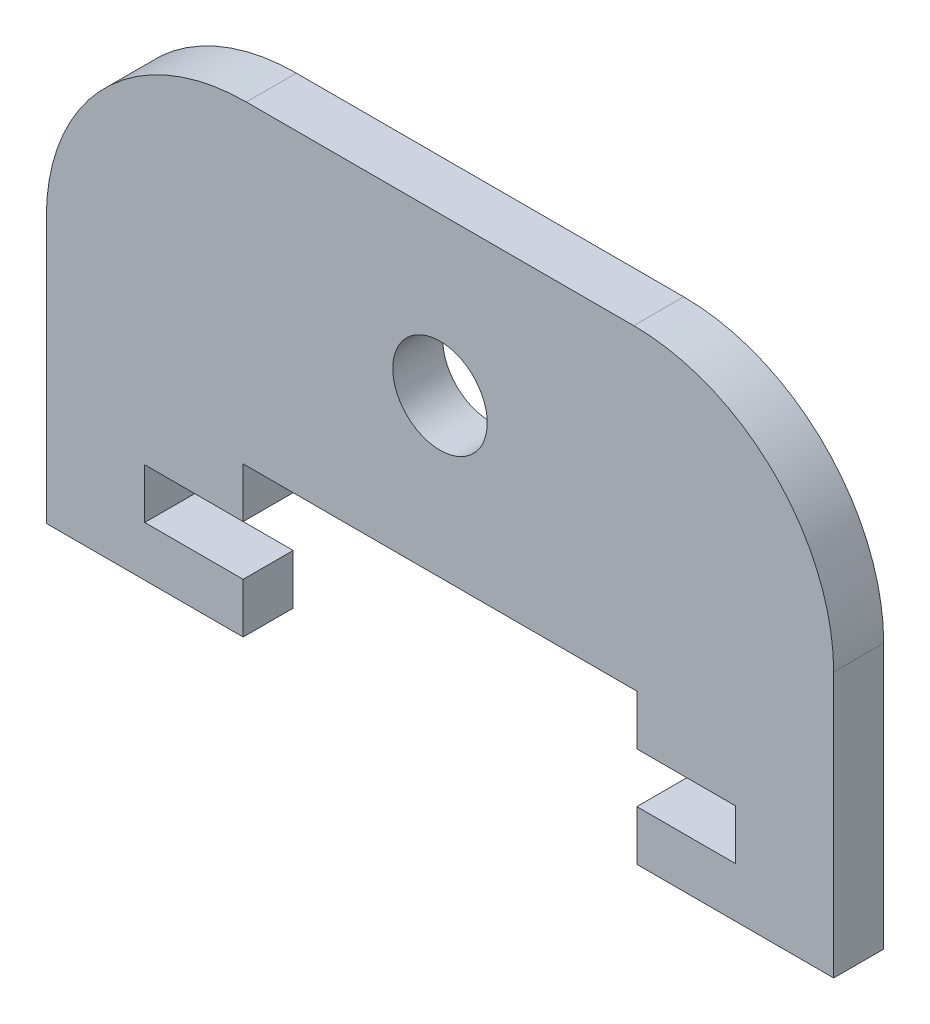
ISO-10303-21;
HEADER;
FILE_DESCRIPTION(('STEP AP214'),'2;1');
FILE_NAME('part.step','',(''),(''),'','','');
FILE_SCHEMA(('AUTOMOTIVE_DESIGN { 1 0 10303 214 1 1 1 1 }'));
ENDSEC;
DATA;
#1=APPLICATION_CONTEXT('core data for automotive mechanical design processes');
#2=APPLICATION_PROTOCOL_DEFINITION('international standard','automotive_design',2000,#1);
#3=PRODUCT_CONTEXT('',#1,'mechanical');
#4=PRODUCT('Part','Part','',(#3));
#5=PRODUCT_RELATED_PRODUCT_CATEGORY('part','',(#4));
#6=PRODUCT_DEFINITION_FORMATION('','',#4);
#7=PRODUCT_DEFINITION_CONTEXT('part definition',#1,'design');
#8=PRODUCT_DEFINITION('design','',#6,#7);
#9=PRODUCT_DEFINITION_SHAPE('','',#8);
#10=(LENGTH_UNIT() NAMED_UNIT(*) SI_UNIT(.MILLI.,.METRE.));
#11=(NAMED_UNIT(*) PLANE_ANGLE_UNIT() SI_UNIT($,.RADIAN.));
#12=(NAMED_UNIT(*) SI_UNIT($,.STERADIAN.) SOLID_ANGLE_UNIT());
#13=UNCERTAINTY_MEASURE_WITH_UNIT(LENGTH_MEASURE(1.E-05),#10,'distance_accuracy_value','');
#14=(GEOMETRIC_REPRESENTATION_CONTEXT(3) GLOBAL_UNCERTAINTY_ASSIGNED_CONTEXT((#13)) GLOBAL_UNIT_ASSIGNED_CONTEXT((#10,
#11,#12)) REPRESENTATION_CONTEXT('',''));
#15=CARTESIAN_POINT('',(0.,0.,0.));
#16=DIRECTION('',(0.,0.,1.));
#17=DIRECTION('',(1.,0.,0.));
#18=AXIS2_PLACEMENT_3D('',#15,#16,#17);
#19=CARTESIAN_POINT('',(24.9999999745,0.,6.35));
#20=DIRECTION('',(-1.,0.,0.));
#21=DIRECTION('',(0.,-1.,0.));
#22=AXIS2_PLACEMENT_3D('',#19,#20,#21);
#23=PLANE('',#22);
#24=DIRECTION('',(0.,1.,0.));
#25=VECTOR('',#24,1.);
#26=CARTESIAN_POINT('',(24.9999999745,0.,0.));
#27=LINE('',#26,#25);
#28=CARTESIAN_POINT('',(24.9999999745,-19.05,0.));
#29=VERTEX_POINT('',#28);
#30=CARTESIAN_POINT('',(24.9999999745,-12.7,0.));
#31=VERTEX_POINT('',#30);
#32=EDGE_CURVE('E188',#29,#31,#27,.T.);
#33=ORIENTED_EDGE('',*,*,#32,.T.);
#34=DIRECTION('',(0.,0.,1.));
#35=VECTOR('',#34,1.);
#36=CARTESIAN_POINT('',(24.9999999745,-12.7,0.));
#37=LINE('',#36,#35);
#38=CARTESIAN_POINT('',(24.9999999745,-12.7,6.35));
#39=VERTEX_POINT('',#38);
#40=EDGE_CURVE('E168',#31,#39,#37,.T.);
#41=ORIENTED_EDGE('',*,*,#40,.T.);
#42=DIRECTION('',(0.,1.,0.));
#43=VECTOR('',#42,1.);
#44=CARTESIAN_POINT('',(24.9999999745,-19.05,6.35));
#45=LINE('',#44,#43);
#46=CARTESIAN_POINT('',(24.9999999745,-19.05,6.35));
#47=VERTEX_POINT('',#46);
#48=EDGE_CURVE('E298',#47,#39,#45,.T.);
#49=ORIENTED_EDGE('',*,*,#48,.F.);
#50=DIRECTION('',(0.,0.,-1.));
#51=VECTOR('',#50,1.);
#52=CARTESIAN_POINT('',(24.9999999745,-19.05,6.35));
#53=LINE('',#52,#51);
#54=EDGE_CURVE('E214',#47,#29,#53,.T.);
#55=ORIENTED_EDGE('',*,*,#54,.T.);
#56=EDGE_LOOP('',(#33,#41,#49,#55));
#57=FACE_BOUND('',#56,.T.);
#58=ADVANCED_FACE('F34',(#57),#23,.F.);
#59=CARTESIAN_POINT('',(74.9999999235,-19.05,6.35));
#60=DIRECTION('',(1.,0.,0.));
#61=DIRECTION('',(0.,0.,-1.));
#62=AXIS2_PLACEMENT_3D('',#59,#60,#61);
#63=PLANE('',#62);
#64=DIRECTION('',(0.,-1.,0.));
#65=VECTOR('',#64,1.);
#66=CARTESIAN_POINT('',(74.9999999235,-19.05,0.));
#67=LINE('',#66,#65);
#68=CARTESIAN_POINT('',(74.9999999235,0.,0.));
#69=VERTEX_POINT('',#68);
#70=CARTESIAN_POINT('',(74.9999999235,-6.35,0.));
#71=VERTEX_POINT('',#70);
#72=EDGE_CURVE('E183',#69,#71,#67,.T.);
#73=ORIENTED_EDGE('',*,*,#72,.T.);
#74=DIRECTION('',(0.,0.,1.));
#75=VECTOR('',#74,1.);
#76=CARTESIAN_POINT('',(74.9999999235,-6.35,0.));
#77=LINE('',#76,#75);
#78=CARTESIAN_POINT('',(74.9999999235,-6.35,6.35));
#79=VERTEX_POINT('',#78);
#80=EDGE_CURVE('E293',#71,#79,#77,.T.);
#81=ORIENTED_EDGE('',*,*,#80,.T.);
#82=DIRECTION('',(0.,-1.,0.));
#83=VECTOR('',#82,1.);
#84=CARTESIAN_POINT('',(74.9999999235,0.,6.35));
#85=LINE('',#84,#83);
#86=CARTESIAN_POINT('',(74.9999999235,0.,6.35));
#87=VERTEX_POINT('',#86);
#88=EDGE_CURVE('E259',#87,#79,#85,.T.);
#89=ORIENTED_EDGE('',*,*,#88,.F.);
#90=DIRECTION('',(0.,0.,-1.));
#91=VECTOR('',#90,1.);
#92=CARTESIAN_POINT('',(74.9999999235,0.,6.35));
#93=LINE('',#92,#91);
#94=EDGE_CURVE('E208',#87,#69,#93,.T.);
#95=ORIENTED_EDGE('',*,*,#94,.T.);
#96=EDGE_LOOP('',(#73,#81,#89,#95));
#97=FACE_BOUND('',#96,.T.);
#98=ADVANCED_FACE('F291',(#97),#63,.F.);
#99=CARTESIAN_POINT('',(0.,-19.05,6.35));
#100=DIRECTION('',(0.,1.,0.));
#101=DIRECTION('',(0.,0.,1.));
#102=AXIS2_PLACEMENT_3D('',#99,#100,#101);
#103=PLANE('',#102);
#104=DIRECTION('',(1.,0.,0.));
#105=VECTOR('',#104,1.);
#106=CARTESIAN_POINT('',(0.,-19.05,0.));
#107=LINE('',#106,#105);
#108=CARTESIAN_POINT('',(0.,-19.05,0.));
#109=VERTEX_POINT('',#108);
#110=EDGE_CURVE('E266',#109,#29,#107,.T.);
#111=ORIENTED_EDGE('',*,*,#110,.T.);
#112=ORIENTED_EDGE('',*,*,#54,.F.);
#113=DIRECTION('',(1.,0.,0.));
#114=VECTOR('',#113,1.);
#115=CARTESIAN_POINT('',(0.,-19.05,6.35));
#116=LINE('',#115,#114);
#117=CARTESIAN_POINT('',(0.,-19.05,6.35));
#118=VERTEX_POINT('',#117);
#119=EDGE_CURVE('E302',#118,#47,#116,.T.);
#120=ORIENTED_EDGE('',*,*,#119,.F.);
#121=DIRECTION('',(0.,0.,-1.));
#122=VECTOR('',#121,1.);
#123=CARTESIAN_POINT('',(0.,-19.05,6.35));
#124=LINE('',#123,#122);
#125=EDGE_CURVE('E217',#118,#109,#124,.T.);
#126=ORIENTED_EDGE('',*,*,#125,.T.);
#127=EDGE_LOOP('',(#111,#112,#120,#126));
#128=FACE_BOUND('',#127,.T.);
#129=ADVANCED_FACE('F357',(#128),#103,.F.);
#130=CARTESIAN_POINT('',(24.9999999745,-6.35,6.35));
#131=VERTEX_POINT('',#130);
#132=CARTESIAN_POINT('',(24.9999999745,0.,6.35));
#133=VERTEX_POINT('',#132);
#134=EDGE_CURVE('E297',#131,#133,#45,.T.);
#135=ORIENTED_EDGE('',*,*,#134,.F.);
#136=DIRECTION('',(0.,0.,1.));
#137=VECTOR('',#136,1.);
#138=CARTESIAN_POINT('',(24.9999999745,-6.35,0.));
#139=LINE('',#138,#137);
#140=CARTESIAN_POINT('',(24.9999999745,-6.35,0.));
#141=VERTEX_POINT('',#140);
#142=EDGE_CURVE('E280',#141,#131,#139,.T.);
#143=ORIENTED_EDGE('',*,*,#142,.F.);
#144=CARTESIAN_POINT('',(24.9999999745,0.,0.));
#145=VERTEX_POINT('',#144);
#146=EDGE_CURVE('E268',#141,#145,#27,.T.);
#147=ORIENTED_EDGE('',*,*,#146,.T.);
#148=DIRECTION('',(0.,0.,-1.));
#149=VECTOR('',#148,1.);
#150=CARTESIAN_POINT('',(24.9999999745,0.,6.35));
#151=LINE('',#150,#149);
#152=EDGE_CURVE('E211',#133,#145,#151,.T.);
#153=ORIENTED_EDGE('',*,*,#152,.F.);
#154=EDGE_LOOP('',(#135,#143,#147,#153));
#155=FACE_BOUND('',#154,.T.);
#156=ADVANCED_FACE('F278',(#155),#23,.F.);
#157=CARTESIAN_POINT('',(24.9999999745,0.,6.35));
#158=DIRECTION('',(0.,1.,0.));
#159=DIRECTION('',(-1.,0.,0.));
#160=AXIS2_PLACEMENT_3D('',#157,#158,#159);
#161=PLANE('',#160);
#162=DIRECTION('',(1.,0.,0.));
#163=VECTOR('',#162,1.);
#164=CARTESIAN_POINT('',(24.9999999745,0.,0.));
#165=LINE('',#164,#163);
#166=EDGE_CURVE('E184',#145,#69,#165,.T.);
#167=ORIENTED_EDGE('',*,*,#166,.T.);
#168=ORIENTED_EDGE('',*,*,#94,.F.);
#169=DIRECTION('',(1.,0.,0.));
#170=VECTOR('',#169,1.);
#171=CARTESIAN_POINT('',(24.9999999745,0.,6.35));
#172=LINE('',#171,#170);
#173=EDGE_CURVE('E286',#133,#87,#172,.T.);
#174=ORIENTED_EDGE('',*,*,#173,.F.);
#175=ORIENTED_EDGE('',*,*,#152,.T.);
#176=EDGE_LOOP('',(#167,#168,#174,#175));
#177=FACE_BOUND('',#176,.T.);
#178=ADVANCED_FACE('F284',(#177),#161,.F.);
#179=CARTESIAN_POINT('',(74.9999999235,-12.7,6.35));
#180=VERTEX_POINT('',#179);
#181=CARTESIAN_POINT('',(74.9999999235,-19.05,6.35));
#182=VERTEX_POINT('',#181);
#183=EDGE_CURVE('E176',#180,#182,#85,.T.);
#184=ORIENTED_EDGE('',*,*,#183,.F.);
#185=DIRECTION('',(0.,0.,1.));
#186=VECTOR('',#185,1.);
#187=CARTESIAN_POINT('',(74.9999999235,-12.7,0.));
#188=LINE('',#187,#186);
#189=CARTESIAN_POINT('',(74.9999999235,-12.7,0.));
#190=VERTEX_POINT('',#189);
#191=EDGE_CURVE('E163',#190,#180,#188,.T.);
#192=ORIENTED_EDGE('',*,*,#191,.F.);
#193=CARTESIAN_POINT('',(74.9999999235,-19.05,0.));
#194=VERTEX_POINT('',#193);
#195=EDGE_CURVE('E174',#190,#194,#67,.T.);
#196=ORIENTED_EDGE('',*,*,#195,.T.);
#197=DIRECTION('',(0.,0.,-1.));
#198=VECTOR('',#197,1.);
#199=CARTESIAN_POINT('',(74.9999999235,-19.05,6.35));
#200=LINE('',#199,#198);
#201=EDGE_CURVE('E205',#182,#194,#200,.T.);
#202=ORIENTED_EDGE('',*,*,#201,.F.);
#203=EDGE_LOOP('',(#184,#192,#196,#202));
#204=FACE_BOUND('',#203,.T.);
#205=ADVANCED_FACE('F172',(#204),#63,.F.);
#206=CARTESIAN_POINT('',(99.999999898,-19.05,6.35));
#207=DIRECTION('',(0.,1.,0.));
#208=DIRECTION('',(-1.,0.,0.));
#209=AXIS2_PLACEMENT_3D('',#206,#207,#208);
#210=PLANE('',#209);
#211=DIRECTION('',(1.,0.,0.));
#212=VECTOR('',#211,1.);
#213=CARTESIAN_POINT('',(99.999999898,-19.05,0.));
#214=LINE('',#213,#212);
#215=CARTESIAN_POINT('',(99.999999898,-19.05,0.));
#216=VERTEX_POINT('',#215);
#217=EDGE_CURVE('E182',#194,#216,#214,.T.);
#218=ORIENTED_EDGE('',*,*,#217,.T.);
#219=DIRECTION('',(0.,0.,-1.));
#220=VECTOR('',#219,1.);
#221=CARTESIAN_POINT('',(99.999999898,-19.05,6.35));
#222=LINE('',#221,#220);
#223=CARTESIAN_POINT('',(99.999999898,-19.05,6.35));
#224=VERTEX_POINT('',#223);
#225=EDGE_CURVE('E202',#224,#216,#222,.T.);
#226=ORIENTED_EDGE('',*,*,#225,.F.);
#227=DIRECTION('',(1.,0.,0.));
#228=VECTOR('',#227,1.);
#229=CARTESIAN_POINT('',(99.999999898,-19.05,6.35));
#230=LINE('',#229,#228);
#231=EDGE_CURVE('E258',#182,#224,#230,.T.);
#232=ORIENTED_EDGE('',*,*,#231,.F.);
#233=ORIENTED_EDGE('',*,*,#201,.T.);
#234=EDGE_LOOP('',(#218,#226,#232,#233));
#235=FACE_BOUND('',#234,.T.);
#236=ADVANCED_FACE('F257',(#235),#210,.F.);
#237=CARTESIAN_POINT('',(99.999999898,0.,6.35));
#238=DIRECTION('',(-1.,0.,0.));
#239=DIRECTION('',(0.,-1.,0.));
#240=AXIS2_PLACEMENT_3D('',#237,#238,#239);
#241=PLANE('',#240);
#242=DIRECTION('',(0.,1.,0.));
#243=VECTOR('',#242,1.);
#244=CARTESIAN_POINT('',(99.999999898,0.,0.));
#245=LINE('',#244,#243);
#246=CARTESIAN_POINT('',(99.999999898,14.60000001,0.));
#247=VERTEX_POINT('',#246);
#248=EDGE_CURVE('E193',#216,#247,#245,.T.);
#249=ORIENTED_EDGE('',*,*,#248,.T.);
#250=DIRECTION('',(0.,0.,-1.));
#251=VECTOR('',#250,1.);
#252=CARTESIAN_POINT('',(99.999999898,14.60000001,6.35));
#253=LINE('',#252,#251);
#254=CARTESIAN_POINT('',(99.999999898,14.60000001,6.35));
#255=VERTEX_POINT('',#254);
#256=EDGE_CURVE('E229',#247,#255,#253,.F.);
#257=ORIENTED_EDGE('',*,*,#256,.T.);
#258=DIRECTION('',(0.,1.,0.));
#259=VECTOR('',#258,1.);
#260=CARTESIAN_POINT('',(99.999999898,-6.34999999999999,6.35));
#261=LINE('',#260,#259);
#262=EDGE_CURVE('E242',#224,#255,#261,.T.);
#263=ORIENTED_EDGE('',*,*,#262,.F.);
#264=ORIENTED_EDGE('',*,*,#225,.T.);
#265=EDGE_LOOP('',(#249,#257,#263,#264));
#266=FACE_BOUND('',#265,.T.);
#267=ADVANCED_FACE('F253',(#266),#241,.F.);
#268=CARTESIAN_POINT('',(0.,40.00000001,6.35));
#269=DIRECTION('',(0.,-1.,0.));
#270=DIRECTION('',(1.,0.,0.));
#271=AXIS2_PLACEMENT_3D('',#268,#269,#270);
#272=PLANE('',#271);
#273=DIRECTION('',(-1.,0.,0.));
#274=VECTOR('',#273,1.);
#275=CARTESIAN_POINT('',(0.,40.00000001,6.35));
#276=LINE('',#275,#274);
#277=CARTESIAN_POINT('',(74.599999898,40.00000001,6.35));
#278=VERTEX_POINT('',#277);
#279=CARTESIAN_POINT('',(25.4,40.00000001,6.35));
#280=VERTEX_POINT('',#279);
#281=EDGE_CURVE('E206',#278,#280,#276,.T.);
#282=ORIENTED_EDGE('',*,*,#281,.F.);
#283=DIRECTION('',(0.,0.,-1.));
#284=VECTOR('',#283,1.);
#285=CARTESIAN_POINT('',(74.599999898,40.00000001,6.35));
#286=LINE('',#285,#284);
#287=CARTESIAN_POINT('',(74.599999898,40.00000001,0.));
#288=VERTEX_POINT('',#287);
#289=EDGE_CURVE('E222',#278,#288,#286,.T.);
#290=ORIENTED_EDGE('',*,*,#289,.T.);
#291=DIRECTION('',(-1.,0.,0.));
#292=VECTOR('',#291,1.);
#293=CARTESIAN_POINT('',(0.,40.00000001,0.));
#294=LINE('',#293,#292);
#295=CARTESIAN_POINT('',(25.4,40.00000001,0.));
#296=VERTEX_POINT('',#295);
#297=EDGE_CURVE('E196',#288,#296,#294,.T.);
#298=ORIENTED_EDGE('',*,*,#297,.T.);
#299=DIRECTION('',(0.,0.,-1.));
#300=VECTOR('',#299,1.);
#301=CARTESIAN_POINT('',(25.4,40.00000001,6.35));
#302=LINE('',#301,#300);
#303=EDGE_CURVE('E220',#296,#280,#302,.F.);
#304=ORIENTED_EDGE('',*,*,#303,.T.);
#305=EDGE_LOOP('',(#282,#290,#298,#304));
#306=FACE_BOUND('',#305,.T.);
#307=ADVANCED_FACE('F247',(#306),#272,.F.);
#308=CARTESIAN_POINT('',(0.,0.,6.35));
#309=DIRECTION('',(1.,0.,0.));
#310=DIRECTION('',(0.,0.,-1.));
#311=AXIS2_PLACEMENT_3D('',#308,#309,#310);
#312=PLANE('',#311);
#313=DIRECTION('',(0.,-1.,0.));
#314=VECTOR('',#313,1.);
#315=CARTESIAN_POINT('',(0.,0.,6.35));
#316=LINE('',#315,#314);
#317=CARTESIAN_POINT('',(0.,14.60000001,6.35));
#318=VERTEX_POINT('',#317);
#319=EDGE_CURVE('E201',#318,#118,#316,.T.);
#320=ORIENTED_EDGE('',*,*,#319,.F.);
#321=DIRECTION('',(0.,0.,-1.));
#322=VECTOR('',#321,1.);
#323=CARTESIAN_POINT('',(0.,14.60000001,6.35));
#324=LINE('',#323,#322);
#325=CARTESIAN_POINT('',(0.,14.60000001,0.));
#326=VERTEX_POINT('',#325);
#327=EDGE_CURVE('E11',#318,#326,#324,.T.);
#328=ORIENTED_EDGE('',*,*,#327,.T.);
#329=DIRECTION('',(0.,-1.,0.));
#330=VECTOR('',#329,1.);
#331=CARTESIAN_POINT('',(0.,0.,0.));
#332=LINE('',#331,#330);
#333=EDGE_CURVE('E199',#326,#109,#332,.T.);
#334=ORIENTED_EDGE('',*,*,#333,.T.);
#335=ORIENTED_EDGE('',*,*,#125,.F.);
#336=EDGE_LOOP('',(#320,#328,#334,#335));
#337=FACE_BOUND('',#336,.T.);
#338=ADVANCED_FACE('F389',(#337),#312,.F.);
#339=CARTESIAN_POINT('',(0.,0.,6.35));
#340=DIRECTION('',(0.,0.,1.));
#341=DIRECTION('',(1.,0.,0.));
#342=AXIS2_PLACEMENT_3D('',#339,#340,#341);
#343=PLANE('',#342);
#344=DIRECTION('',(-1.,0.,0.));
#345=VECTOR('',#344,1.);
#346=CARTESIAN_POINT('',(0.,-6.34999999999999,6.35));
#347=LINE('',#346,#345);
#348=CARTESIAN_POINT('',(87.49999991075,-6.35,6.35));
#349=VERTEX_POINT('',#348);
#350=EDGE_CURVE('E295',#349,#79,#347,.T.);
#351=ORIENTED_EDGE('',*,*,#350,.F.);
#352=DIRECTION('',(0.,1.,0.));
#353=VECTOR('',#352,1.);
#354=CARTESIAN_POINT('',(87.49999991075,0.,6.35));
#355=LINE('',#354,#353);
#356=CARTESIAN_POINT('',(87.49999991075,-12.7,6.35));
#357=VERTEX_POINT('',#356);
#358=EDGE_CURVE('E311',#357,#349,#355,.T.);
#359=ORIENTED_EDGE('',*,*,#358,.F.);
#360=DIRECTION('',(1.,0.,0.));
#361=VECTOR('',#360,1.);
#362=CARTESIAN_POINT('',(0.,-12.7,6.35));
#363=LINE('',#362,#361);
#364=EDGE_CURVE('E313',#180,#357,#363,.T.);
#365=ORIENTED_EDGE('',*,*,#364,.F.);
#366=ORIENTED_EDGE('',*,*,#183,.T.);
#367=ORIENTED_EDGE('',*,*,#231,.T.);
#368=ORIENTED_EDGE('',*,*,#262,.T.);
#369=CARTESIAN_POINT('',(74.599999898,14.60000001,6.35));
#370=DIRECTION('',(0.,0.,1.));
#371=DIRECTION('',(1.,0.,0.));
#372=AXIS2_PLACEMENT_3D('',#369,#370,#371);
#373=CIRCLE('',#372,25.4);
#374=EDGE_CURVE('E42',#255,#278,#373,.T.);
#375=ORIENTED_EDGE('',*,*,#374,.T.);
#376=ORIENTED_EDGE('',*,*,#281,.T.);
#377=CARTESIAN_POINT('',(25.4,14.60000001,6.35));
#378=DIRECTION('',(0.,0.,1.));
#379=DIRECTION('',(1.,0.,0.));
#380=AXIS2_PLACEMENT_3D('',#377,#378,#379);
#381=CIRCLE('',#380,25.4);
#382=EDGE_CURVE('E231',#280,#318,#381,.T.);
#383=ORIENTED_EDGE('',*,*,#382,.T.);
#384=ORIENTED_EDGE('',*,*,#319,.T.);
#385=ORIENTED_EDGE('',*,*,#119,.T.);
#386=ORIENTED_EDGE('',*,*,#48,.T.);
#387=DIRECTION('',(1.,0.,0.));
#388=VECTOR('',#387,1.);
#389=CARTESIAN_POINT('',(0.,-12.7,6.35));
#390=LINE('',#389,#388);
#391=CARTESIAN_POINT('',(12.49999998725,-12.7,6.35));
#392=VERTEX_POINT('',#391);
#393=EDGE_CURVE('E315',#392,#39,#390,.T.);
#394=ORIENTED_EDGE('',*,*,#393,.F.);
#395=DIRECTION('',(0.,-1.,0.));
#396=VECTOR('',#395,1.);
#397=CARTESIAN_POINT('',(12.49999998725,0.,6.35));
#398=LINE('',#397,#396);
#399=CARTESIAN_POINT('',(12.49999998725,-6.35,6.35));
#400=VERTEX_POINT('',#399);
#401=EDGE_CURVE('E317',#400,#392,#398,.T.);
#402=ORIENTED_EDGE('',*,*,#401,.F.);
#403=DIRECTION('',(-1.,0.,0.));
#404=VECTOR('',#403,1.);
#405=CARTESIAN_POINT('',(0.,-6.35,6.35));
#406=LINE('',#405,#404);
#407=EDGE_CURVE('E319',#131,#400,#406,.T.);
#408=ORIENTED_EDGE('',*,*,#407,.F.);
#409=ORIENTED_EDGE('',*,*,#134,.T.);
#410=ORIENTED_EDGE('',*,*,#173,.T.);
#411=ORIENTED_EDGE('',*,*,#88,.T.);
#412=EDGE_LOOP('',(#351,#359,#365,#366,#367,#368,#375,#376,#383,#384,#385,#386,#394,#402,#408,
#409,#410,#411));
#413=FACE_BOUND('',#412,.T.);
#414=CARTESIAN_POINT('',(49.999999949,20.000000005,6.35));
#415=DIRECTION('',(0.,0.,1.));
#416=DIRECTION('',(1.,0.,0.));
#417=AXIS2_PLACEMENT_3D('',#414,#415,#416);
#418=CIRCLE('',#417,5.99999993800001);
#419=CARTESIAN_POINT('',(55.999999887,20.000000005,6.35));
#420=VERTEX_POINT('',#419);
#421=EDGE_CURVE('E269',#420,#420,#418,.T.);
#422=ORIENTED_EDGE('',*,*,#421,.F.);
#423=EDGE_LOOP('',(#422));
#424=FACE_BOUND('',#423,.T.);
#425=ADVANCED_FACE('F238',(#413,#424),#343,.T.);
#426=CARTESIAN_POINT('',(0.,0.,0.));
#427=DIRECTION('',(0.,0.,1.));
#428=DIRECTION('',(1.,0.,0.));
#429=AXIS2_PLACEMENT_3D('',#426,#427,#428);
#430=PLANE('',#429);
#431=CARTESIAN_POINT('',(49.999999949,20.000000005,0.));
#432=DIRECTION('',(0.,0.,1.));
#433=DIRECTION('',(1.,0.,0.));
#434=AXIS2_PLACEMENT_3D('',#431,#432,#433);
#435=CIRCLE('',#434,5.99999993800001);
#436=CARTESIAN_POINT('',(55.999999887,20.000000005,0.));
#437=VERTEX_POINT('',#436);
#438=EDGE_CURVE('E307',#437,#437,#435,.T.);
#439=ORIENTED_EDGE('',*,*,#438,.T.);
#440=EDGE_LOOP('',(#439));
#441=FACE_BOUND('',#440,.T.);
#442=DIRECTION('',(0.,1.,0.));
#443=VECTOR('',#442,1.);
#444=CARTESIAN_POINT('',(87.49999991075,-6.35,0.));
#445=LINE('',#444,#443);
#446=CARTESIAN_POINT('',(87.49999991075,-12.7,0.));
#447=VERTEX_POINT('',#446);
#448=CARTESIAN_POINT('',(87.49999991075,-6.35,0.));
#449=VERTEX_POINT('',#448);
#450=EDGE_CURVE('E49',#447,#449,#445,.T.);
#451=ORIENTED_EDGE('',*,*,#450,.T.);
#452=DIRECTION('',(-1.,0.,0.));
#453=VECTOR('',#452,1.);
#454=CARTESIAN_POINT('',(74.9999999235,-6.35,0.));
#455=LINE('',#454,#453);
#456=EDGE_CURVE('E177',#449,#71,#455,.T.);
#457=ORIENTED_EDGE('',*,*,#456,.T.);
#458=ORIENTED_EDGE('',*,*,#72,.F.);
#459=ORIENTED_EDGE('',*,*,#166,.F.);
#460=ORIENTED_EDGE('',*,*,#146,.F.);
#461=DIRECTION('',(-1.,0.,0.));
#462=VECTOR('',#461,1.);
#463=CARTESIAN_POINT('',(24.9999999745,-6.35,0.));
#464=LINE('',#463,#462);
#465=CARTESIAN_POINT('',(12.49999998725,-6.35,0.));
#466=VERTEX_POINT('',#465);
#467=EDGE_CURVE('E332',#141,#466,#464,.T.);
#468=ORIENTED_EDGE('',*,*,#467,.T.);
#469=DIRECTION('',(0.,-1.,0.));
#470=VECTOR('',#469,1.);
#471=CARTESIAN_POINT('',(12.49999998725,-6.35,0.));
#472=LINE('',#471,#470);
#473=CARTESIAN_POINT('',(12.49999998725,-12.7,0.));
#474=VERTEX_POINT('',#473);
#475=EDGE_CURVE('E57',#466,#474,#472,.T.);
#476=ORIENTED_EDGE('',*,*,#475,.T.);
#477=DIRECTION('',(1.,0.,0.));
#478=VECTOR('',#477,1.);
#479=CARTESIAN_POINT('',(12.49999998725,-12.7,0.));
#480=LINE('',#479,#478);
#481=EDGE_CURVE('E323',#474,#31,#480,.T.);
#482=ORIENTED_EDGE('',*,*,#481,.T.);
#483=ORIENTED_EDGE('',*,*,#32,.F.);
#484=ORIENTED_EDGE('',*,*,#110,.F.);
#485=ORIENTED_EDGE('',*,*,#333,.F.);
#486=CARTESIAN_POINT('',(25.4,14.60000001,0.));
#487=DIRECTION('',(0.,0.,1.));
#488=DIRECTION('',(1.,0.,0.));
#489=AXIS2_PLACEMENT_3D('',#486,#487,#488);
#490=CIRCLE('',#489,25.4);
#491=EDGE_CURVE('E225',#326,#296,#490,.F.);
#492=ORIENTED_EDGE('',*,*,#491,.T.);
#493=ORIENTED_EDGE('',*,*,#297,.F.);
#494=CARTESIAN_POINT('',(74.599999898,14.60000001,0.));
#495=DIRECTION('',(0.,0.,1.));
#496=DIRECTION('',(1.,0.,0.));
#497=AXIS2_PLACEMENT_3D('',#494,#495,#496);
#498=CIRCLE('',#497,25.4);
#499=EDGE_CURVE('E227',#288,#247,#498,.F.);
#500=ORIENTED_EDGE('',*,*,#499,.T.);
#501=ORIENTED_EDGE('',*,*,#248,.F.);
#502=ORIENTED_EDGE('',*,*,#217,.F.);
#503=ORIENTED_EDGE('',*,*,#195,.F.);
#504=DIRECTION('',(1.,0.,0.));
#505=VECTOR('',#504,1.);
#506=CARTESIAN_POINT('',(87.49999991075,-12.7,0.));
#507=LINE('',#506,#505);
#508=EDGE_CURVE('E160',#190,#447,#507,.T.);
#509=ORIENTED_EDGE('',*,*,#508,.T.);
#510=EDGE_LOOP('',(#451,#457,#458,#459,#460,#468,#476,#482,#483,#484,#485,#492,#493,#500,#501,
#502,#503,#509));
#511=FACE_BOUND('',#510,.T.);
#512=ADVANCED_FACE('F180',(#441,#511),#430,.F.);
#513=CARTESIAN_POINT('',(49.999999949,20.000000005,0.));
#514=DIRECTION('',(0.,0.,1.));
#515=DIRECTION('',(1.,0.,0.));
#516=AXIS2_PLACEMENT_3D('',#513,#514,#515);
#517=CYLINDRICAL_SURFACE('',#516,5.99999993800001);
#518=ORIENTED_EDGE('',*,*,#421,.T.);
#519=EDGE_LOOP('',(#518));
#520=FACE_BOUND('',#519,.T.);
#521=ORIENTED_EDGE('',*,*,#438,.F.);
#522=EDGE_LOOP('',(#521));
#523=FACE_BOUND('',#522,.T.);
#524=ADVANCED_FACE('F370',(#520,#523),#517,.F.);
#525=CARTESIAN_POINT('',(74.599999898,14.60000001,6.35));
#526=DIRECTION('',(0.,0.,-1.));
#527=DIRECTION('',(-1.,0.,0.));
#528=AXIS2_PLACEMENT_3D('',#525,#526,#527);
#529=CYLINDRICAL_SURFACE('',#528,25.4);
#530=ORIENTED_EDGE('',*,*,#374,.F.);
#531=ORIENTED_EDGE('',*,*,#256,.F.);
#532=ORIENTED_EDGE('',*,*,#499,.F.);
#533=ORIENTED_EDGE('',*,*,#289,.F.);
#534=EDGE_LOOP('',(#530,#531,#532,#533));
#535=FACE_BOUND('',#534,.T.);
#536=ADVANCED_FACE('F251',(#535),#529,.T.);
#537=CARTESIAN_POINT('',(25.4,14.60000001,6.35));
#538=DIRECTION('',(0.,0.,-1.));
#539=DIRECTION('',(-1.,0.,0.));
#540=AXIS2_PLACEMENT_3D('',#537,#538,#539);
#541=CYLINDRICAL_SURFACE('',#540,25.4);
#542=ORIENTED_EDGE('',*,*,#382,.F.);
#543=ORIENTED_EDGE('',*,*,#303,.F.);
#544=ORIENTED_EDGE('',*,*,#491,.F.);
#545=ORIENTED_EDGE('',*,*,#327,.F.);
#546=EDGE_LOOP('',(#542,#543,#544,#545));
#547=FACE_BOUND('',#546,.T.);
#548=ADVANCED_FACE('F36',(#547),#541,.T.);
#549=CARTESIAN_POINT('',(12.49999998725,-12.7,0.));
#550=DIRECTION('',(0.,-1.,0.));
#551=DIRECTION('',(1.,0.,0.));
#552=AXIS2_PLACEMENT_3D('',#549,#550,#551);
#553=PLANE('',#552);
#554=ORIENTED_EDGE('',*,*,#393,.T.);
#555=ORIENTED_EDGE('',*,*,#40,.F.);
#556=ORIENTED_EDGE('',*,*,#481,.F.);
#557=DIRECTION('',(0.,0.,1.));
#558=VECTOR('',#557,1.);
#559=CARTESIAN_POINT('',(12.49999998725,-12.7,0.));
#560=LINE('',#559,#558);
#561=EDGE_CURVE('E325',#474,#392,#560,.T.);
#562=ORIENTED_EDGE('',*,*,#561,.T.);
#563=EDGE_LOOP('',(#554,#555,#556,#562));
#564=FACE_BOUND('',#563,.T.);
#565=ADVANCED_FACE('F375',(#564),#553,.F.);
#566=CARTESIAN_POINT('',(12.49999998725,-6.35,0.));
#567=DIRECTION('',(-1.,0.,0.));
#568=DIRECTION('',(0.,-1.,0.));
#569=AXIS2_PLACEMENT_3D('',#566,#567,#568);
#570=PLANE('',#569);
#571=ORIENTED_EDGE('',*,*,#401,.T.);
#572=ORIENTED_EDGE('',*,*,#561,.F.);
#573=ORIENTED_EDGE('',*,*,#475,.F.);
#574=DIRECTION('',(0.,0.,1.));
#575=VECTOR('',#574,1.);
#576=CARTESIAN_POINT('',(12.49999998725,-6.35,0.));
#577=LINE('',#576,#575);
#578=EDGE_CURVE('E322',#466,#400,#577,.T.);
#579=ORIENTED_EDGE('',*,*,#578,.T.);
#580=EDGE_LOOP('',(#571,#572,#573,#579));
#581=FACE_BOUND('',#580,.T.);
#582=ADVANCED_FACE('F438',(#581),#570,.F.);
#583=CARTESIAN_POINT('',(24.9999999745,-6.35,0.));
#584=DIRECTION('',(0.,1.,0.));
#585=DIRECTION('',(-1.,0.,0.));
#586=AXIS2_PLACEMENT_3D('',#583,#584,#585);
#587=PLANE('',#586);
#588=ORIENTED_EDGE('',*,*,#407,.T.);
#589=ORIENTED_EDGE('',*,*,#578,.F.);
#590=ORIENTED_EDGE('',*,*,#467,.F.);
#591=ORIENTED_EDGE('',*,*,#142,.T.);
#592=EDGE_LOOP('',(#588,#589,#590,#591));
#593=FACE_BOUND('',#592,.T.);
#594=ADVANCED_FACE('F350',(#593),#587,.F.);
#595=CARTESIAN_POINT('',(74.9999999235,-6.35,0.));
#596=DIRECTION('',(0.,1.,0.));
#597=DIRECTION('',(-1.,0.,0.));
#598=AXIS2_PLACEMENT_3D('',#595,#596,#597);
#599=PLANE('',#598);
#600=ORIENTED_EDGE('',*,*,#350,.T.);
#601=ORIENTED_EDGE('',*,*,#80,.F.);
#602=ORIENTED_EDGE('',*,*,#456,.F.);
#603=DIRECTION('',(0.,0.,1.));
#604=VECTOR('',#603,1.);
#605=CARTESIAN_POINT('',(87.49999991075,-6.35,0.));
#606=LINE('',#605,#604);
#607=EDGE_CURVE('E335',#449,#349,#606,.T.);
#608=ORIENTED_EDGE('',*,*,#607,.T.);
#609=EDGE_LOOP('',(#600,#601,#602,#608));
#610=FACE_BOUND('',#609,.T.);
#611=ADVANCED_FACE('F341',(#610),#599,.F.);
#612=CARTESIAN_POINT('',(87.49999991075,-6.35,0.));
#613=DIRECTION('',(1.,0.,0.));
#614=DIRECTION('',(0.,0.,-1.));
#615=AXIS2_PLACEMENT_3D('',#612,#613,#614);
#616=PLANE('',#615);
#617=ORIENTED_EDGE('',*,*,#358,.T.);
#618=ORIENTED_EDGE('',*,*,#607,.F.);
#619=ORIENTED_EDGE('',*,*,#450,.F.);
#620=DIRECTION('',(0.,0.,1.));
#621=VECTOR('',#620,1.);
#622=CARTESIAN_POINT('',(87.49999991075,-12.7,0.));
#623=LINE('',#622,#621);
#624=EDGE_CURVE('E165',#447,#357,#623,.T.);
#625=ORIENTED_EDGE('',*,*,#624,.T.);
#626=EDGE_LOOP('',(#617,#618,#619,#625));
#627=FACE_BOUND('',#626,.T.);
#628=ADVANCED_FACE('F342',(#627),#616,.F.);
#629=CARTESIAN_POINT('',(87.49999991075,-12.7,0.));
#630=DIRECTION('',(0.,-1.,0.));
#631=DIRECTION('',(0.,0.,-1.));
#632=AXIS2_PLACEMENT_3D('',#629,#630,#631);
#633=PLANE('',#632);
#634=ORIENTED_EDGE('',*,*,#364,.T.);
#635=ORIENTED_EDGE('',*,*,#624,.F.);
#636=ORIENTED_EDGE('',*,*,#508,.F.);
#637=ORIENTED_EDGE('',*,*,#191,.T.);
#638=EDGE_LOOP('',(#634,#635,#636,#637));
#639=FACE_BOUND('',#638,.T.);
#640=ADVANCED_FACE('F162',(#639),#633,.F.);
#641=CLOSED_SHELL('',(#58,#98,#129,#156,#178,#205,#236,#267,#307,#338,#425,#512,#524,#536,#548,
#565,#582,#594,#611,#628,#640));
#642=MANIFOLD_SOLID_BREP('B2',#641);
#643=ADVANCED_BREP_SHAPE_REPRESENTATION('',(#18,#642),#14);
#644=SHAPE_DEFINITION_REPRESENTATION(#9,#643);
ENDSEC;
END-ISO-10303-21;
